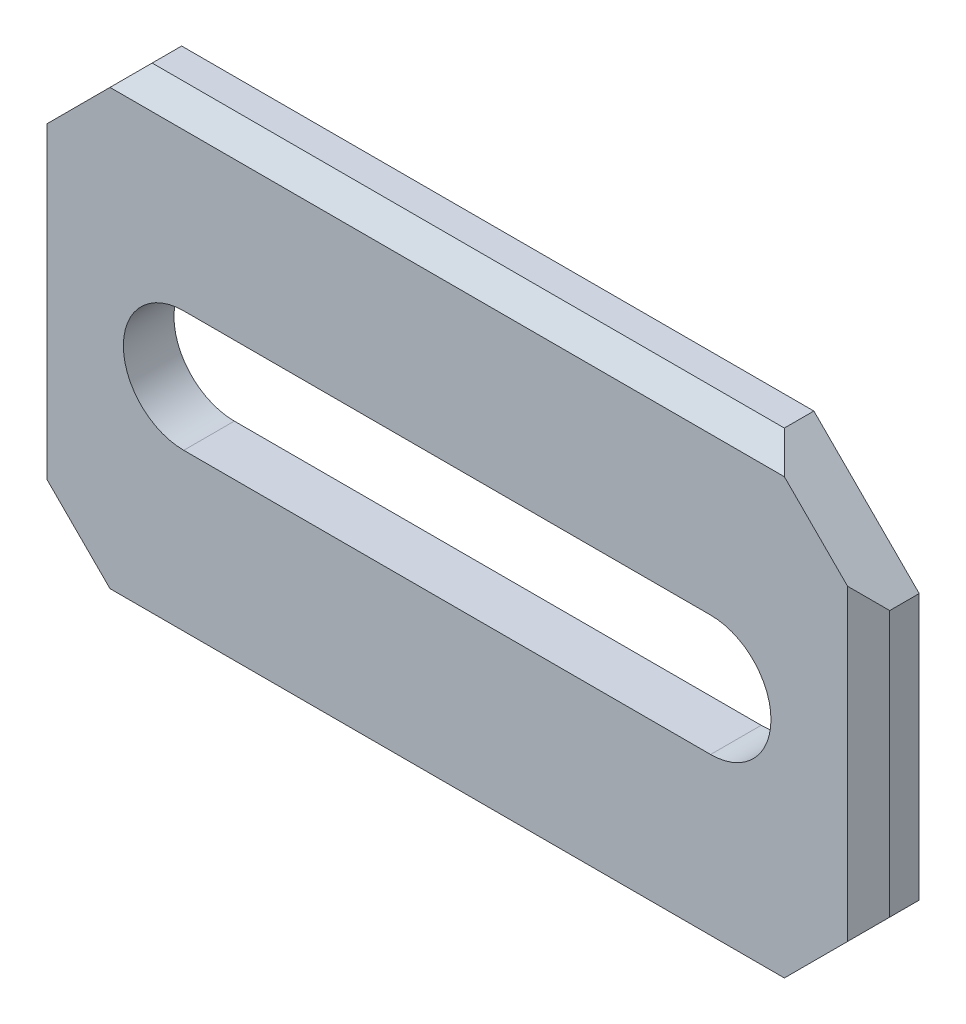
ISO-10303-21;
HEADER;
FILE_DESCRIPTION(('STEP AP214'),'2;1');
FILE_NAME('part.step','',(''),(''),'','','');
FILE_SCHEMA(('AUTOMOTIVE_DESIGN { 1 0 10303 214 1 1 1 1 }'));
ENDSEC;
DATA;
#1=APPLICATION_CONTEXT('core data for automotive mechanical design processes');
#2=APPLICATION_PROTOCOL_DEFINITION('international standard','automotive_design',2000,#1);
#3=PRODUCT_CONTEXT('',#1,'mechanical');
#4=PRODUCT('Part','Part','',(#3));
#5=PRODUCT_RELATED_PRODUCT_CATEGORY('part','',(#4));
#6=PRODUCT_DEFINITION_FORMATION('','',#4);
#7=PRODUCT_DEFINITION_CONTEXT('part definition',#1,'design');
#8=PRODUCT_DEFINITION('design','',#6,#7);
#9=PRODUCT_DEFINITION_SHAPE('','',#8);
#10=(LENGTH_UNIT() NAMED_UNIT(*) SI_UNIT(.MILLI.,.METRE.));
#11=(NAMED_UNIT(*) PLANE_ANGLE_UNIT() SI_UNIT($,.RADIAN.));
#12=(NAMED_UNIT(*) SI_UNIT($,.STERADIAN.) SOLID_ANGLE_UNIT());
#13=UNCERTAINTY_MEASURE_WITH_UNIT(LENGTH_MEASURE(1.E-05),#10,'distance_accuracy_value','');
#14=(GEOMETRIC_REPRESENTATION_CONTEXT(3) GLOBAL_UNCERTAINTY_ASSIGNED_CONTEXT((#13)) GLOBAL_UNIT_ASSIGNED_CONTEXT((#10,
#11,#12)) REPRESENTATION_CONTEXT('',''));
#15=CARTESIAN_POINT('',(0.,0.,0.));
#16=DIRECTION('',(0.,0.,1.));
#17=DIRECTION('',(1.,0.,0.));
#18=AXIS2_PLACEMENT_3D('',#15,#16,#17);
#19=CARTESIAN_POINT('',(0.,0.,1.2));
#20=DIRECTION('',(0.,0.,-1.));
#21=DIRECTION('',(-1.,0.,0.));
#22=AXIS2_PLACEMENT_3D('',#19,#20,#21);
#23=PLANE('',#22);
#24=DIRECTION('',(-0.707106781186549,-0.707106781186547,0.));
#25=VECTOR('',#24,1.);
#26=CARTESIAN_POINT('',(20.,-6.3,1.2));
#27=LINE('',#26,#25);
#28=CARTESIAN_POINT('',(16.,-10.3,1.2));
#29=VERTEX_POINT('',#28);
#30=CARTESIAN_POINT('',(19.,-7.29999999999999,1.2));
#31=VERTEX_POINT('',#30);
#32=EDGE_CURVE('E223',#29,#31,#27,.F.);
#33=ORIENTED_EDGE('',*,*,#32,.T.);
#34=DIRECTION('',(0.,1.,0.));
#35=VECTOR('',#34,1.);
#36=CARTESIAN_POINT('',(19.,0.,1.2));
#37=LINE('',#36,#35);
#38=CARTESIAN_POINT('',(19.,7.29999999999999,1.2));
#39=VERTEX_POINT('',#38);
#40=EDGE_CURVE('E247',#31,#39,#37,.T.);
#41=ORIENTED_EDGE('',*,*,#40,.T.);
#42=DIRECTION('',(0.707106781186547,-0.707106781186549,0.));
#43=VECTOR('',#42,1.);
#44=CARTESIAN_POINT('',(15.,11.3,1.2));
#45=LINE('',#44,#43);
#46=CARTESIAN_POINT('',(16.,10.3,1.2));
#47=VERTEX_POINT('',#46);
#48=EDGE_CURVE('E226',#39,#47,#45,.F.);
#49=ORIENTED_EDGE('',*,*,#48,.T.);
#50=DIRECTION('',(-1.,0.,0.));
#51=VECTOR('',#50,1.);
#52=CARTESIAN_POINT('',(0.,10.3,1.2));
#53=LINE('',#52,#51);
#54=CARTESIAN_POINT('',(-16.,10.3,1.2));
#55=VERTEX_POINT('',#54);
#56=EDGE_CURVE('E238',#47,#55,#53,.T.);
#57=ORIENTED_EDGE('',*,*,#56,.T.);
#58=DIRECTION('',(0.707106781186549,0.707106781186547,0.));
#59=VECTOR('',#58,1.);
#60=CARTESIAN_POINT('',(-20.,6.3,1.2));
#61=LINE('',#60,#59);
#62=CARTESIAN_POINT('',(-19.,7.29999999999999,1.2));
#63=VERTEX_POINT('',#62);
#64=EDGE_CURVE('E217',#55,#63,#61,.F.);
#65=ORIENTED_EDGE('',*,*,#64,.T.);
#66=DIRECTION('',(0.,-1.,0.));
#67=VECTOR('',#66,1.);
#68=CARTESIAN_POINT('',(-19.,0.,1.2));
#69=LINE('',#68,#67);
#70=CARTESIAN_POINT('',(-19.,-7.29999999999999,1.2));
#71=VERTEX_POINT('',#70);
#72=EDGE_CURVE('E244',#63,#71,#69,.T.);
#73=ORIENTED_EDGE('',*,*,#72,.T.);
#74=DIRECTION('',(-0.707106781186547,0.707106781186549,0.));
#75=VECTOR('',#74,1.);
#76=CARTESIAN_POINT('',(-15.,-11.3,1.2));
#77=LINE('',#76,#75);
#78=CARTESIAN_POINT('',(-16.,-10.3,1.2));
#79=VERTEX_POINT('',#78);
#80=EDGE_CURVE('E220',#71,#79,#77,.F.);
#81=ORIENTED_EDGE('',*,*,#80,.T.);
#82=DIRECTION('',(1.,0.,0.));
#83=VECTOR('',#82,1.);
#84=CARTESIAN_POINT('',(0.,-10.3,1.2));
#85=LINE('',#84,#83);
#86=EDGE_CURVE('E241',#79,#29,#85,.T.);
#87=ORIENTED_EDGE('',*,*,#86,.T.);
#88=EDGE_LOOP('',(#33,#41,#49,#57,#65,#73,#81,#87));
#89=FACE_BOUND('',#88,.T.);
#90=CARTESIAN_POINT('',(-12.5,0.,1.2));
#91=DIRECTION('',(0.,0.,1.));
#92=DIRECTION('',(1.,0.,0.));
#93=AXIS2_PLACEMENT_3D('',#90,#91,#92);
#94=CIRCLE('',#93,2.86462425899126);
#95=CARTESIAN_POINT('',(-12.5,2.86462425899126,1.2));
#96=VERTEX_POINT('',#95);
#97=CARTESIAN_POINT('',(-12.5,-2.86462425899126,1.2));
#98=VERTEX_POINT('',#97);
#99=EDGE_CURVE('E148',#96,#98,#94,.T.);
#100=ORIENTED_EDGE('',*,*,#99,.F.);
#101=DIRECTION('',(-1.,0.,0.));
#102=VECTOR('',#101,1.);
#103=CARTESIAN_POINT('',(-12.5,2.86462425899126,1.2));
#104=LINE('',#103,#102);
#105=CARTESIAN_POINT('',(12.5,2.86462425899127,1.2));
#106=VERTEX_POINT('',#105);
#107=EDGE_CURVE('E173',#106,#96,#104,.T.);
#108=ORIENTED_EDGE('',*,*,#107,.F.);
#109=CARTESIAN_POINT('',(12.5,0.,1.2));
#110=DIRECTION('',(0.,0.,1.));
#111=DIRECTION('',(1.,0.,0.));
#112=AXIS2_PLACEMENT_3D('',#109,#110,#111);
#113=CIRCLE('',#112,2.86462425899126);
#114=CARTESIAN_POINT('',(12.5,-2.86462425899126,1.2));
#115=VERTEX_POINT('',#114);
#116=EDGE_CURVE('E171',#115,#106,#113,.T.);
#117=ORIENTED_EDGE('',*,*,#116,.F.);
#118=DIRECTION('',(1.,0.,0.));
#119=VECTOR('',#118,1.);
#120=CARTESIAN_POINT('',(-12.5,-2.86462425899126,1.2));
#121=LINE('',#120,#119);
#122=EDGE_CURVE('E158',#98,#115,#121,.T.);
#123=ORIENTED_EDGE('',*,*,#122,.F.);
#124=EDGE_LOOP('',(#100,#108,#117,#123));
#125=FACE_BOUND('',#124,.T.);
#126=ADVANCED_FACE('F33',(#89,#125),#23,.F.);
#127=CARTESIAN_POINT('',(0.,0.,-1.2));
#128=DIRECTION('',(0.,0.,-1.));
#129=DIRECTION('',(-1.,0.,0.));
#130=AXIS2_PLACEMENT_3D('',#127,#128,#129);
#131=PLANE('',#130);
#132=DIRECTION('',(-1.,0.,0.));
#133=VECTOR('',#132,1.);
#134=CARTESIAN_POINT('',(-20.,11.3,-1.2));
#135=LINE('',#134,#133);
#136=CARTESIAN_POINT('',(15.,11.3,-1.2));
#137=VERTEX_POINT('',#136);
#138=CARTESIAN_POINT('',(-15.,11.3,-1.2));
#139=VERTEX_POINT('',#138);
#140=EDGE_CURVE('E191',#137,#139,#135,.T.);
#141=ORIENTED_EDGE('',*,*,#140,.F.);
#142=DIRECTION('',(-0.707106781186547,0.707106781186549,0.));
#143=VECTOR('',#142,1.);
#144=CARTESIAN_POINT('',(13.15,13.15,-1.2));
#145=LINE('',#144,#143);
#146=CARTESIAN_POINT('',(20.,6.29999999999998,-1.2));
#147=VERTEX_POINT('',#146);
#148=EDGE_CURVE('E210',#137,#147,#145,.F.);
#149=ORIENTED_EDGE('',*,*,#148,.T.);
#150=DIRECTION('',(0.,1.,0.));
#151=VECTOR('',#150,1.);
#152=CARTESIAN_POINT('',(20.,-11.3,-1.2));
#153=LINE('',#152,#151);
#154=CARTESIAN_POINT('',(20.,-6.3,-1.2));
#155=VERTEX_POINT('',#154);
#156=EDGE_CURVE('E166',#155,#147,#153,.T.);
#157=ORIENTED_EDGE('',*,*,#156,.F.);
#158=DIRECTION('',(0.707106781186549,0.707106781186547,0.));
#159=VECTOR('',#158,1.);
#160=CARTESIAN_POINT('',(13.15,-13.15,-1.2));
#161=LINE('',#160,#159);
#162=CARTESIAN_POINT('',(15.,-11.3,-1.2));
#163=VERTEX_POINT('',#162);
#164=EDGE_CURVE('E208',#155,#163,#161,.F.);
#165=ORIENTED_EDGE('',*,*,#164,.T.);
#166=DIRECTION('',(1.,0.,0.));
#167=VECTOR('',#166,1.);
#168=CARTESIAN_POINT('',(-20.,-11.3,-1.2));
#169=LINE('',#168,#167);
#170=CARTESIAN_POINT('',(-15.,-11.3,-1.2));
#171=VERTEX_POINT('',#170);
#172=EDGE_CURVE('E197',#171,#163,#169,.T.);
#173=ORIENTED_EDGE('',*,*,#172,.F.);
#174=DIRECTION('',(0.707106781186547,-0.707106781186549,0.));
#175=VECTOR('',#174,1.);
#176=CARTESIAN_POINT('',(-13.15,-13.15,-1.2));
#177=LINE('',#176,#175);
#178=CARTESIAN_POINT('',(-20.,-6.29999999999999,-1.2));
#179=VERTEX_POINT('',#178);
#180=EDGE_CURVE('E206',#171,#179,#177,.F.);
#181=ORIENTED_EDGE('',*,*,#180,.T.);
#182=DIRECTION('',(0.,-1.,0.));
#183=VECTOR('',#182,1.);
#184=CARTESIAN_POINT('',(-20.,-11.3,-1.2));
#185=LINE('',#184,#183);
#186=CARTESIAN_POINT('',(-20.,6.3,-1.2));
#187=VERTEX_POINT('',#186);
#188=EDGE_CURVE('E194',#187,#179,#185,.T.);
#189=ORIENTED_EDGE('',*,*,#188,.F.);
#190=DIRECTION('',(-0.707106781186549,-0.707106781186547,0.));
#191=VECTOR('',#190,1.);
#192=CARTESIAN_POINT('',(-13.15,13.15,-1.2));
#193=LINE('',#192,#191);
#194=EDGE_CURVE('E204',#187,#139,#193,.F.);
#195=ORIENTED_EDGE('',*,*,#194,.T.);
#196=EDGE_LOOP('',(#141,#149,#157,#165,#173,#181,#189,#195));
#197=FACE_BOUND('',#196,.T.);
#198=DIRECTION('',(-1.,0.,0.));
#199=VECTOR('',#198,1.);
#200=CARTESIAN_POINT('',(-12.5,2.86462425899126,-1.2));
#201=LINE('',#200,#199);
#202=CARTESIAN_POINT('',(12.5,2.86462425899127,-1.2));
#203=VERTEX_POINT('',#202);
#204=CARTESIAN_POINT('',(-12.5,2.86462425899126,-1.2));
#205=VERTEX_POINT('',#204);
#206=EDGE_CURVE('E159',#203,#205,#201,.T.);
#207=ORIENTED_EDGE('',*,*,#206,.T.);
#208=CARTESIAN_POINT('',(-12.5,0.,-1.2));
#209=DIRECTION('',(0.,0.,1.));
#210=DIRECTION('',(1.,0.,0.));
#211=AXIS2_PLACEMENT_3D('',#208,#209,#210);
#212=CIRCLE('',#211,2.86462425899126);
#213=CARTESIAN_POINT('',(-12.5,-2.86462425899126,-1.2));
#214=VERTEX_POINT('',#213);
#215=EDGE_CURVE('E177',#205,#214,#212,.T.);
#216=ORIENTED_EDGE('',*,*,#215,.T.);
#217=DIRECTION('',(1.,0.,0.));
#218=VECTOR('',#217,1.);
#219=CARTESIAN_POINT('',(-12.5,-2.86462425899126,-1.2));
#220=LINE('',#219,#218);
#221=CARTESIAN_POINT('',(12.5,-2.86462425899126,-1.2));
#222=VERTEX_POINT('',#221);
#223=EDGE_CURVE('E165',#214,#222,#220,.T.);
#224=ORIENTED_EDGE('',*,*,#223,.T.);
#225=CARTESIAN_POINT('',(12.5,0.,-1.2));
#226=DIRECTION('',(0.,0.,1.));
#227=DIRECTION('',(1.,0.,0.));
#228=AXIS2_PLACEMENT_3D('',#225,#226,#227);
#229=CIRCLE('',#228,2.86462425899126);
#230=EDGE_CURVE('E180',#222,#203,#229,.T.);
#231=ORIENTED_EDGE('',*,*,#230,.T.);
#232=EDGE_LOOP('',(#207,#216,#224,#231));
#233=FACE_BOUND('',#232,.T.);
#234=ADVANCED_FACE('F313',(#197,#233),#131,.T.);
#235=CARTESIAN_POINT('',(20.,-11.3,1.2));
#236=DIRECTION('',(-1.,0.,0.));
#237=DIRECTION('',(0.,0.,1.));
#238=AXIS2_PLACEMENT_3D('',#235,#236,#237);
#239=PLANE('',#238);
#240=DIRECTION('',(0.,0.,1.));
#241=VECTOR('',#240,1.);
#242=CARTESIAN_POINT('',(20.,6.29999999999998,1.2));
#243=LINE('',#242,#241);
#244=CARTESIAN_POINT('',(20.,6.29999999999998,0.199999999999992));
#245=VERTEX_POINT('',#244);
#246=EDGE_CURVE('E214',#147,#245,#243,.T.);
#247=ORIENTED_EDGE('',*,*,#246,.T.);
#248=DIRECTION('',(0.,-1.,0.));
#249=VECTOR('',#248,1.);
#250=CARTESIAN_POINT('',(20.,-11.3,0.199999999999992));
#251=LINE('',#250,#249);
#252=CARTESIAN_POINT('',(20.,-6.3,0.199999999999992));
#253=VERTEX_POINT('',#252);
#254=EDGE_CURVE('E254',#245,#253,#251,.T.);
#255=ORIENTED_EDGE('',*,*,#254,.T.);
#256=DIRECTION('',(0.,0.,-1.));
#257=VECTOR('',#256,1.);
#258=CARTESIAN_POINT('',(20.,-6.3,1.2));
#259=LINE('',#258,#257);
#260=EDGE_CURVE('E212',#253,#155,#259,.T.);
#261=ORIENTED_EDGE('',*,*,#260,.T.);
#262=ORIENTED_EDGE('',*,*,#156,.T.);
#263=EDGE_LOOP('',(#247,#255,#261,#262));
#264=FACE_BOUND('',#263,.T.);
#265=ADVANCED_FACE('F317',(#264),#239,.F.);
#266=CARTESIAN_POINT('',(-20.,11.3,1.2));
#267=DIRECTION('',(0.,-1.,0.));
#268=DIRECTION('',(0.,0.,-1.));
#269=AXIS2_PLACEMENT_3D('',#266,#267,#268);
#270=PLANE('',#269);
#271=DIRECTION('',(0.,0.,1.));
#272=VECTOR('',#271,1.);
#273=CARTESIAN_POINT('',(-15.,11.3,1.2));
#274=LINE('',#273,#272);
#275=CARTESIAN_POINT('',(-15.,11.3,0.199999999999992));
#276=VERTEX_POINT('',#275);
#277=EDGE_CURVE('E200',#139,#276,#274,.T.);
#278=ORIENTED_EDGE('',*,*,#277,.T.);
#279=DIRECTION('',(1.,0.,0.));
#280=VECTOR('',#279,1.);
#281=CARTESIAN_POINT('',(-20.,11.3,0.199999999999992));
#282=LINE('',#281,#280);
#283=CARTESIAN_POINT('',(15.,11.3,0.199999999999992));
#284=VERTEX_POINT('',#283);
#285=EDGE_CURVE('E11',#276,#284,#282,.T.);
#286=ORIENTED_EDGE('',*,*,#285,.T.);
#287=DIRECTION('',(0.,0.,-1.));
#288=VECTOR('',#287,1.);
#289=CARTESIAN_POINT('',(15.,11.3,1.2));
#290=LINE('',#289,#288);
#291=EDGE_CURVE('E202',#284,#137,#290,.T.);
#292=ORIENTED_EDGE('',*,*,#291,.T.);
#293=ORIENTED_EDGE('',*,*,#140,.T.);
#294=EDGE_LOOP('',(#278,#286,#292,#293));
#295=FACE_BOUND('',#294,.T.);
#296=ADVANCED_FACE('F319',(#295),#270,.F.);
#297=CARTESIAN_POINT('',(-20.,-11.3,1.2));
#298=DIRECTION('',(1.,0.,0.));
#299=DIRECTION('',(0.,0.,-1.));
#300=AXIS2_PLACEMENT_3D('',#297,#298,#299);
#301=PLANE('',#300);
#302=DIRECTION('',(0.,0.,1.));
#303=VECTOR('',#302,1.);
#304=CARTESIAN_POINT('',(-20.,-6.29999999999999,1.2));
#305=LINE('',#304,#303);
#306=CARTESIAN_POINT('',(-20.,-6.29999999999999,0.199999999999999));
#307=VERTEX_POINT('',#306);
#308=EDGE_CURVE('E236',#179,#307,#305,.T.);
#309=ORIENTED_EDGE('',*,*,#308,.T.);
#310=DIRECTION('',(0.,1.,0.));
#311=VECTOR('',#310,1.);
#312=CARTESIAN_POINT('',(-20.,-11.3,0.199999999999999));
#313=LINE('',#312,#311);
#314=CARTESIAN_POINT('',(-20.,6.3,0.199999999999999));
#315=VERTEX_POINT('',#314);
#316=EDGE_CURVE('E56',#307,#315,#313,.T.);
#317=ORIENTED_EDGE('',*,*,#316,.T.);
#318=DIRECTION('',(0.,0.,-1.));
#319=VECTOR('',#318,1.);
#320=CARTESIAN_POINT('',(-20.,6.3,1.2));
#321=LINE('',#320,#319);
#322=EDGE_CURVE('E234',#315,#187,#321,.T.);
#323=ORIENTED_EDGE('',*,*,#322,.T.);
#324=ORIENTED_EDGE('',*,*,#188,.T.);
#325=EDGE_LOOP('',(#309,#317,#323,#324));
#326=FACE_BOUND('',#325,.T.);
#327=ADVANCED_FACE('F309',(#326),#301,.F.);
#328=CARTESIAN_POINT('',(-20.,-11.3,1.2));
#329=DIRECTION('',(0.,1.,0.));
#330=DIRECTION('',(0.,0.,1.));
#331=AXIS2_PLACEMENT_3D('',#328,#329,#330);
#332=PLANE('',#331);
#333=DIRECTION('',(0.,0.,1.));
#334=VECTOR('',#333,1.);
#335=CARTESIAN_POINT('',(15.,-11.3,1.2));
#336=LINE('',#335,#334);
#337=CARTESIAN_POINT('',(15.,-11.3,0.199999999999992));
#338=VERTEX_POINT('',#337);
#339=EDGE_CURVE('E231',#163,#338,#336,.T.);
#340=ORIENTED_EDGE('',*,*,#339,.T.);
#341=DIRECTION('',(-1.,0.,0.));
#342=VECTOR('',#341,1.);
#343=CARTESIAN_POINT('',(-20.,-11.3,0.199999999999992));
#344=LINE('',#343,#342);
#345=CARTESIAN_POINT('',(-15.,-11.3,0.199999999999992));
#346=VERTEX_POINT('',#345);
#347=EDGE_CURVE('E41',#338,#346,#344,.T.);
#348=ORIENTED_EDGE('',*,*,#347,.T.);
#349=DIRECTION('',(0.,0.,-1.));
#350=VECTOR('',#349,1.);
#351=CARTESIAN_POINT('',(-15.,-11.3,1.2));
#352=LINE('',#351,#350);
#353=EDGE_CURVE('E229',#346,#171,#352,.T.);
#354=ORIENTED_EDGE('',*,*,#353,.T.);
#355=ORIENTED_EDGE('',*,*,#172,.T.);
#356=EDGE_LOOP('',(#340,#348,#354,#355));
#357=FACE_BOUND('',#356,.T.);
#358=ADVANCED_FACE('F270',(#357),#332,.F.);
#359=CARTESIAN_POINT('',(-12.5,0.,1.2));
#360=DIRECTION('',(0.,0.,-1.));
#361=DIRECTION('',(-1.,0.,0.));
#362=AXIS2_PLACEMENT_3D('',#359,#360,#361);
#363=CYLINDRICAL_SURFACE('',#362,2.86462425899126);
#364=ORIENTED_EDGE('',*,*,#215,.F.);
#365=DIRECTION('',(0.,0.,-1.));
#366=VECTOR('',#365,1.);
#367=CARTESIAN_POINT('',(-12.5,2.86462425899126,1.2));
#368=LINE('',#367,#366);
#369=EDGE_CURVE('E154',#96,#205,#368,.T.);
#370=ORIENTED_EDGE('',*,*,#369,.F.);
#371=ORIENTED_EDGE('',*,*,#99,.T.);
#372=DIRECTION('',(0.,0.,-1.));
#373=VECTOR('',#372,1.);
#374=CARTESIAN_POINT('',(-12.5,-2.86462425899126,1.2));
#375=LINE('',#374,#373);
#376=EDGE_CURVE('E151',#98,#214,#375,.T.);
#377=ORIENTED_EDGE('',*,*,#376,.T.);
#378=EDGE_LOOP('',(#364,#370,#371,#377));
#379=FACE_BOUND('',#378,.T.);
#380=ADVANCED_FACE('F150',(#379),#363,.F.);
#381=CARTESIAN_POINT('',(-12.5,-2.86462425899126,1.2));
#382=DIRECTION('',(0.,1.,0.));
#383=DIRECTION('',(-1.,0.,0.));
#384=AXIS2_PLACEMENT_3D('',#381,#382,#383);
#385=PLANE('',#384);
#386=ORIENTED_EDGE('',*,*,#223,.F.);
#387=ORIENTED_EDGE('',*,*,#376,.F.);
#388=ORIENTED_EDGE('',*,*,#122,.T.);
#389=DIRECTION('',(0.,0.,-1.));
#390=VECTOR('',#389,1.);
#391=CARTESIAN_POINT('',(12.5,-2.86462425899126,1.2));
#392=LINE('',#391,#390);
#393=EDGE_CURVE('E167',#115,#222,#392,.T.);
#394=ORIENTED_EDGE('',*,*,#393,.T.);
#395=EDGE_LOOP('',(#386,#387,#388,#394));
#396=FACE_BOUND('',#395,.T.);
#397=ADVANCED_FACE('F162',(#396),#385,.T.);
#398=CARTESIAN_POINT('',(12.5,0.,1.2));
#399=DIRECTION('',(0.,0.,-1.));
#400=DIRECTION('',(-1.,0.,0.));
#401=AXIS2_PLACEMENT_3D('',#398,#399,#400);
#402=CYLINDRICAL_SURFACE('',#401,2.86462425899126);
#403=ORIENTED_EDGE('',*,*,#230,.F.);
#404=ORIENTED_EDGE('',*,*,#393,.F.);
#405=ORIENTED_EDGE('',*,*,#116,.T.);
#406=DIRECTION('',(0.,0.,-1.));
#407=VECTOR('',#406,1.);
#408=CARTESIAN_POINT('',(12.5,2.86462425899127,1.2));
#409=LINE('',#408,#407);
#410=EDGE_CURVE('E186',#106,#203,#409,.T.);
#411=ORIENTED_EDGE('',*,*,#410,.T.);
#412=EDGE_LOOP('',(#403,#404,#405,#411));
#413=FACE_BOUND('',#412,.T.);
#414=ADVANCED_FACE('F344',(#413),#402,.F.);
#415=CARTESIAN_POINT('',(-12.5,2.86462425899126,1.2));
#416=DIRECTION('',(0.,-1.,0.));
#417=DIRECTION('',(1.,0.,0.));
#418=AXIS2_PLACEMENT_3D('',#415,#416,#417);
#419=PLANE('',#418);
#420=ORIENTED_EDGE('',*,*,#206,.F.);
#421=ORIENTED_EDGE('',*,*,#410,.F.);
#422=ORIENTED_EDGE('',*,*,#107,.T.);
#423=ORIENTED_EDGE('',*,*,#369,.T.);
#424=EDGE_LOOP('',(#420,#421,#422,#423));
#425=FACE_BOUND('',#424,.T.);
#426=ADVANCED_FACE('F348',(#425),#419,.T.);
#427=CARTESIAN_POINT('',(15.,11.3,1.2));
#428=DIRECTION('',(-0.707106781186549,-0.707106781186547,0.));
#429=DIRECTION('',(0.,0.,-1.));
#430=AXIS2_PLACEMENT_3D('',#427,#428,#429);
#431=PLANE('',#430);
#432=ORIENTED_EDGE('',*,*,#48,.F.);
#433=DIRECTION('',(0.577350269189624,-0.577350269189626,-0.577350269189628));
#434=VECTOR('',#433,1.);
#435=CARTESIAN_POINT('',(16.3333333333333,9.96666666666665,3.86666666666668));
#436=LINE('',#435,#434);
#437=EDGE_CURVE('E252',#39,#245,#436,.T.);
#438=ORIENTED_EDGE('',*,*,#437,.T.);
#439=ORIENTED_EDGE('',*,*,#246,.F.);
#440=ORIENTED_EDGE('',*,*,#148,.F.);
#441=ORIENTED_EDGE('',*,*,#291,.F.);
#442=DIRECTION('',(0.577350269189623,-0.577350269189625,0.577350269189629));
#443=VECTOR('',#442,1.);
#444=CARTESIAN_POINT('',(15.3333333333333,10.9666666666667,0.533333333333332));
#445=LINE('',#444,#443);
#446=EDGE_CURVE('E250',#284,#47,#445,.T.);
#447=ORIENTED_EDGE('',*,*,#446,.T.);
#448=EDGE_LOOP('',(#432,#438,#439,#440,#441,#447));
#449=FACE_BOUND('',#448,.T.);
#450=ADVANCED_FACE('F296',(#449),#431,.F.);
#451=CARTESIAN_POINT('',(20.,-6.3,1.2));
#452=DIRECTION('',(-0.707106781186547,0.707106781186549,0.));
#453=DIRECTION('',(0.,0.,-1.));
#454=AXIS2_PLACEMENT_3D('',#451,#452,#453);
#455=PLANE('',#454);
#456=ORIENTED_EDGE('',*,*,#260,.F.);
#457=DIRECTION('',(-0.577350269189625,-0.577350269189623,0.577350269189629));
#458=VECTOR('',#457,1.);
#459=CARTESIAN_POINT('',(19.6666666666667,-6.63333333333333,0.533333333333332));
#460=LINE('',#459,#458);
#461=EDGE_CURVE('E258',#253,#31,#460,.T.);
#462=ORIENTED_EDGE('',*,*,#461,.T.);
#463=ORIENTED_EDGE('',*,*,#32,.F.);
#464=DIRECTION('',(-0.577350269189626,-0.577350269189624,-0.577350269189628));
#465=VECTOR('',#464,1.);
#466=CARTESIAN_POINT('',(18.6666666666667,-7.63333333333334,3.86666666666668));
#467=LINE('',#466,#465);
#468=EDGE_CURVE('E256',#29,#338,#467,.T.);
#469=ORIENTED_EDGE('',*,*,#468,.T.);
#470=ORIENTED_EDGE('',*,*,#339,.F.);
#471=ORIENTED_EDGE('',*,*,#164,.F.);
#472=EDGE_LOOP('',(#456,#462,#463,#469,#470,#471));
#473=FACE_BOUND('',#472,.T.);
#474=ADVANCED_FACE('F287',(#473),#455,.F.);
#475=CARTESIAN_POINT('',(-15.,-11.3,1.2));
#476=DIRECTION('',(0.707106781186548,0.707106781186546,0.));
#477=DIRECTION('',(0.,0.,-1.));
#478=AXIS2_PLACEMENT_3D('',#475,#476,#477);
#479=PLANE('',#478);
#480=ORIENTED_EDGE('',*,*,#80,.F.);
#481=DIRECTION('',(-0.577350269189624,0.577350269189626,-0.577350269189628));
#482=VECTOR('',#481,1.);
#483=CARTESIAN_POINT('',(-16.3333333333333,-9.96666666666665,3.86666666666668));
#484=LINE('',#483,#482);
#485=EDGE_CURVE('E262',#71,#307,#484,.T.);
#486=ORIENTED_EDGE('',*,*,#485,.T.);
#487=ORIENTED_EDGE('',*,*,#308,.F.);
#488=ORIENTED_EDGE('',*,*,#180,.F.);
#489=ORIENTED_EDGE('',*,*,#353,.F.);
#490=DIRECTION('',(-0.577350269189623,0.577350269189625,0.577350269189629));
#491=VECTOR('',#490,1.);
#492=CARTESIAN_POINT('',(-15.3333333333333,-10.9666666666667,0.533333333333332));
#493=LINE('',#492,#491);
#494=EDGE_CURVE('E260',#346,#79,#493,.T.);
#495=ORIENTED_EDGE('',*,*,#494,.T.);
#496=EDGE_LOOP('',(#480,#486,#487,#488,#489,#495));
#497=FACE_BOUND('',#496,.T.);
#498=ADVANCED_FACE('F277',(#497),#479,.F.);
#499=CARTESIAN_POINT('',(-20.,6.3,1.2));
#500=DIRECTION('',(0.707106781186547,-0.707106781186549,0.));
#501=DIRECTION('',(0.,0.,-1.));
#502=AXIS2_PLACEMENT_3D('',#499,#500,#501);
#503=PLANE('',#502);
#504=ORIENTED_EDGE('',*,*,#322,.F.);
#505=DIRECTION('',(0.577350269189625,0.577350269189623,0.577350269189629));
#506=VECTOR('',#505,1.);
#507=CARTESIAN_POINT('',(-19.6666666666667,6.63333333333333,0.533333333333336));
#508=LINE('',#507,#506);
#509=EDGE_CURVE('E266',#315,#63,#508,.T.);
#510=ORIENTED_EDGE('',*,*,#509,.T.);
#511=ORIENTED_EDGE('',*,*,#64,.F.);
#512=DIRECTION('',(0.577350269189626,0.577350269189624,-0.577350269189628));
#513=VECTOR('',#512,1.);
#514=CARTESIAN_POINT('',(-18.6666666666666,7.63333333333334,3.86666666666668));
#515=LINE('',#514,#513);
#516=EDGE_CURVE('E48',#55,#276,#515,.T.);
#517=ORIENTED_EDGE('',*,*,#516,.T.);
#518=ORIENTED_EDGE('',*,*,#277,.F.);
#519=ORIENTED_EDGE('',*,*,#194,.F.);
#520=EDGE_LOOP('',(#504,#510,#511,#517,#518,#519));
#521=FACE_BOUND('',#520,.T.);
#522=ADVANCED_FACE('F304',(#521),#503,.F.);
#523=CARTESIAN_POINT('',(19.,0.,1.2));
#524=DIRECTION('',(-0.70710678118655,0.,-0.707106781186545));
#525=DIRECTION('',(0.,1.,0.));
#526=AXIS2_PLACEMENT_3D('',#523,#524,#525);
#527=PLANE('',#526);
#528=ORIENTED_EDGE('',*,*,#461,.F.);
#529=ORIENTED_EDGE('',*,*,#254,.F.);
#530=ORIENTED_EDGE('',*,*,#437,.F.);
#531=ORIENTED_EDGE('',*,*,#40,.F.);
#532=EDGE_LOOP('',(#528,#529,#530,#531));
#533=FACE_BOUND('',#532,.T.);
#534=ADVANCED_FACE('F292',(#533),#527,.F.);
#535=CARTESIAN_POINT('',(-19.,0.,1.2));
#536=DIRECTION('',(0.70710678118655,0.,-0.707106781186545));
#537=DIRECTION('',(0.,-1.,0.));
#538=AXIS2_PLACEMENT_3D('',#535,#536,#537);
#539=PLANE('',#538);
#540=ORIENTED_EDGE('',*,*,#509,.F.);
#541=ORIENTED_EDGE('',*,*,#316,.F.);
#542=ORIENTED_EDGE('',*,*,#485,.F.);
#543=ORIENTED_EDGE('',*,*,#72,.F.);
#544=EDGE_LOOP('',(#540,#541,#542,#543));
#545=FACE_BOUND('',#544,.T.);
#546=ADVANCED_FACE('F308',(#545),#539,.F.);
#547=CARTESIAN_POINT('',(0.,-10.3,1.2));
#548=DIRECTION('',(0.,0.70710678118655,-0.707106781186545));
#549=DIRECTION('',(1.,0.,0.));
#550=AXIS2_PLACEMENT_3D('',#547,#548,#549);
#551=PLANE('',#550);
#552=ORIENTED_EDGE('',*,*,#494,.F.);
#553=ORIENTED_EDGE('',*,*,#347,.F.);
#554=ORIENTED_EDGE('',*,*,#468,.F.);
#555=ORIENTED_EDGE('',*,*,#86,.F.);
#556=EDGE_LOOP('',(#552,#553,#554,#555));
#557=FACE_BOUND('',#556,.T.);
#558=ADVANCED_FACE('F281',(#557),#551,.F.);
#559=CARTESIAN_POINT('',(0.,10.3,1.2));
#560=DIRECTION('',(0.,-0.70710678118655,-0.707106781186545));
#561=DIRECTION('',(-1.,0.,0.));
#562=AXIS2_PLACEMENT_3D('',#559,#560,#561);
#563=PLANE('',#562);
#564=ORIENTED_EDGE('',*,*,#446,.F.);
#565=ORIENTED_EDGE('',*,*,#285,.F.);
#566=ORIENTED_EDGE('',*,*,#516,.F.);
#567=ORIENTED_EDGE('',*,*,#56,.F.);
#568=EDGE_LOOP('',(#564,#565,#566,#567));
#569=FACE_BOUND('',#568,.T.);
#570=ADVANCED_FACE('F35',(#569),#563,.F.);
#571=CLOSED_SHELL('',(#126,#234,#265,#296,#327,#358,#380,#397,#414,#426,#450,#474,#498,#522,
#534,#546,#558,#570));
#572=MANIFOLD_SOLID_BREP('B2',#571);
#573=ADVANCED_BREP_SHAPE_REPRESENTATION('',(#18,#572),#14);
#574=SHAPE_DEFINITION_REPRESENTATION(#9,#573);
ENDSEC;
END-ISO-10303-21;
